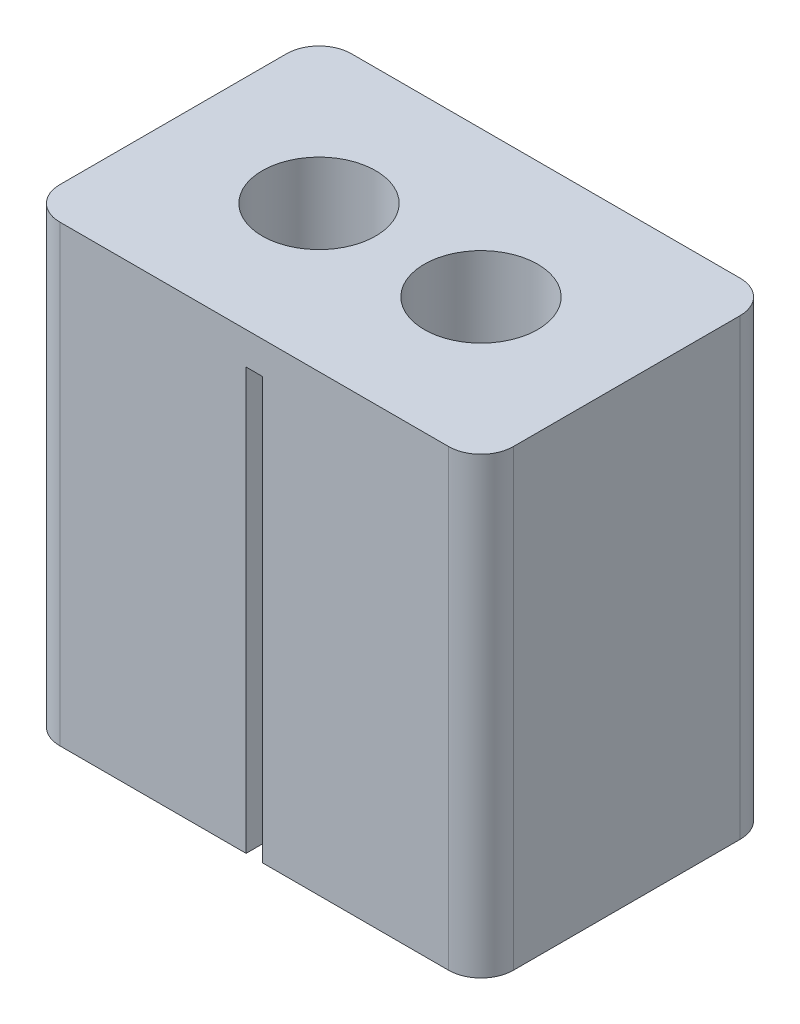
ISO-10303-21;
HEADER;
FILE_DESCRIPTION(('STEP AP214'),'2;1');
FILE_NAME('part.step','',(''),(''),'','','');
FILE_SCHEMA(('AUTOMOTIVE_DESIGN { 1 0 10303 214 1 1 1 1 }'));
ENDSEC;
DATA;
#1=APPLICATION_CONTEXT('core data for automotive mechanical design processes');
#2=APPLICATION_PROTOCOL_DEFINITION('international standard','automotive_design',2000,#1);
#3=PRODUCT_CONTEXT('',#1,'mechanical');
#4=PRODUCT('Part','Part','',(#3));
#5=PRODUCT_RELATED_PRODUCT_CATEGORY('part','',(#4));
#6=PRODUCT_DEFINITION_FORMATION('','',#4);
#7=PRODUCT_DEFINITION_CONTEXT('part definition',#1,'design');
#8=PRODUCT_DEFINITION('design','',#6,#7);
#9=PRODUCT_DEFINITION_SHAPE('','',#8);
#10=(LENGTH_UNIT() NAMED_UNIT(*) SI_UNIT(.MILLI.,.METRE.));
#11=(NAMED_UNIT(*) PLANE_ANGLE_UNIT() SI_UNIT($,.RADIAN.));
#12=(NAMED_UNIT(*) SI_UNIT($,.STERADIAN.) SOLID_ANGLE_UNIT());
#13=UNCERTAINTY_MEASURE_WITH_UNIT(LENGTH_MEASURE(1.E-05),#10,'distance_accuracy_value','');
#14=(GEOMETRIC_REPRESENTATION_CONTEXT(3) GLOBAL_UNCERTAINTY_ASSIGNED_CONTEXT((#13)) GLOBAL_UNIT_ASSIGNED_CONTEXT((#10,
#11,#12)) REPRESENTATION_CONTEXT('',''));
#15=CARTESIAN_POINT('',(0.,0.,0.));
#16=DIRECTION('',(0.,0.,1.));
#17=DIRECTION('',(1.,0.,0.));
#18=AXIS2_PLACEMENT_3D('',#15,#16,#17);
#19=CARTESIAN_POINT('',(0.,0.,0.));
#20=DIRECTION('',(0.,1.,0.));
#21=DIRECTION('',(0.,0.,1.));
#22=AXIS2_PLACEMENT_3D('',#19,#20,#21);
#23=PLANE('',#22);
#24=CARTESIAN_POINT('',(2.5,0.,0.));
#25=DIRECTION('',(0.,1.,0.));
#26=DIRECTION('',(0.,0.,1.));
#27=AXIS2_PLACEMENT_3D('',#24,#25,#26);
#28=CIRCLE('',#27,0.95);
#29=CARTESIAN_POINT('',(2.5,0.,0.950000000000001));
#30=VERTEX_POINT('',#29);
#31=EDGE_CURVE('E219',#30,#30,#28,.F.);
#32=ORIENTED_EDGE('',*,*,#31,.F.);
#33=EDGE_LOOP('',(#32));
#34=FACE_BOUND('',#33,.T.);
#35=DIRECTION('',(1.,0.,0.));
#36=VECTOR('',#35,1.);
#37=CARTESIAN_POINT('',(-7.,0.,4.5));
#38=LINE('',#37,#36);
#39=CARTESIAN_POINT('',(0.25,0.,4.5));
#40=VERTEX_POINT('',#39);
#41=CARTESIAN_POINT('',(6.,0.,4.5));
#42=VERTEX_POINT('',#41);
#43=EDGE_CURVE('E141',#40,#42,#38,.T.);
#44=ORIENTED_EDGE('',*,*,#43,.F.);
#45=DIRECTION('',(0.,0.,1.));
#46=VECTOR('',#45,1.);
#47=CARTESIAN_POINT('',(0.25,0.,4.5));
#48=LINE('',#47,#46);
#49=CARTESIAN_POINT('',(0.25,0.,-4.5));
#50=VERTEX_POINT('',#49);
#51=EDGE_CURVE('E126',#50,#40,#48,.T.);
#52=ORIENTED_EDGE('',*,*,#51,.F.);
#53=DIRECTION('',(-1.,0.,0.));
#54=VECTOR('',#53,1.);
#55=CARTESIAN_POINT('',(-7.,0.,-4.5));
#56=LINE('',#55,#54);
#57=CARTESIAN_POINT('',(6.,0.,-4.5));
#58=VERTEX_POINT('',#57);
#59=EDGE_CURVE('E139',#58,#50,#56,.T.);
#60=ORIENTED_EDGE('',*,*,#59,.F.);
#61=CARTESIAN_POINT('',(6.,0.,-3.5));
#62=DIRECTION('',(0.,1.,0.));
#63=DIRECTION('',(0.,0.,1.));
#64=AXIS2_PLACEMENT_3D('',#61,#62,#63);
#65=CIRCLE('',#64,1.);
#66=CARTESIAN_POINT('',(7.,0.,-3.5));
#67=VERTEX_POINT('',#66);
#68=EDGE_CURVE('E172',#58,#67,#65,.F.);
#69=ORIENTED_EDGE('',*,*,#68,.T.);
#70=DIRECTION('',(0.,0.,-1.));
#71=VECTOR('',#70,1.);
#72=CARTESIAN_POINT('',(7.,0.,-4.5));
#73=LINE('',#72,#71);
#74=CARTESIAN_POINT('',(7.,0.,3.5));
#75=VERTEX_POINT('',#74);
#76=EDGE_CURVE('E154',#75,#67,#73,.T.);
#77=ORIENTED_EDGE('',*,*,#76,.F.);
#78=CARTESIAN_POINT('',(6.,0.,3.5));
#79=DIRECTION('',(0.,1.,0.));
#80=DIRECTION('',(0.,0.,1.));
#81=AXIS2_PLACEMENT_3D('',#78,#79,#80);
#82=CIRCLE('',#81,1.);
#83=EDGE_CURVE('E170',#75,#42,#82,.F.);
#84=ORIENTED_EDGE('',*,*,#83,.T.);
#85=EDGE_LOOP('',(#44,#52,#60,#69,#77,#84));
#86=FACE_BOUND('',#85,.T.);
#87=ADVANCED_FACE('F35',(#34,#86),#23,.F.);
#88=CARTESIAN_POINT('',(7.,14.,-4.5));
#89=DIRECTION('',(-1.,0.,0.));
#90=DIRECTION('',(0.,0.,1.));
#91=AXIS2_PLACEMENT_3D('',#88,#89,#90);
#92=PLANE('',#91);
#93=ORIENTED_EDGE('',*,*,#76,.T.);
#94=DIRECTION('',(0.,-1.,0.));
#95=VECTOR('',#94,1.);
#96=CARTESIAN_POINT('',(7.,14.,-3.5));
#97=LINE('',#96,#95);
#98=CARTESIAN_POINT('',(7.,14.,-3.5));
#99=VERTEX_POINT('',#98);
#100=EDGE_CURVE('E191',#67,#99,#97,.F.);
#101=ORIENTED_EDGE('',*,*,#100,.T.);
#102=DIRECTION('',(0.,0.,-1.));
#103=VECTOR('',#102,1.);
#104=CARTESIAN_POINT('',(7.,14.,-4.5));
#105=LINE('',#104,#103);
#106=CARTESIAN_POINT('',(7.,14.,3.5));
#107=VERTEX_POINT('',#106);
#108=EDGE_CURVE('E161',#107,#99,#105,.T.);
#109=ORIENTED_EDGE('',*,*,#108,.F.);
#110=DIRECTION('',(0.,-1.,0.));
#111=VECTOR('',#110,1.);
#112=CARTESIAN_POINT('',(7.,14.,3.5));
#113=LINE('',#112,#111);
#114=EDGE_CURVE('E188',#107,#75,#113,.T.);
#115=ORIENTED_EDGE('',*,*,#114,.T.);
#116=EDGE_LOOP('',(#93,#101,#109,#115));
#117=FACE_BOUND('',#116,.T.);
#118=ADVANCED_FACE('F257',(#117),#92,.F.);
#119=CARTESIAN_POINT('',(-7.,14.,-4.5));
#120=DIRECTION('',(0.,0.,1.));
#121=DIRECTION('',(1.,0.,0.));
#122=AXIS2_PLACEMENT_3D('',#119,#120,#121);
#123=PLANE('',#122);
#124=ORIENTED_EDGE('',*,*,#59,.T.);
#125=DIRECTION('',(0.,1.,0.));
#126=VECTOR('',#125,1.);
#127=CARTESIAN_POINT('',(0.25,-0.000999999999999265,-4.5));
#128=LINE('',#127,#126);
#129=CARTESIAN_POINT('',(0.25,13.,-4.5));
#130=VERTEX_POINT('',#129);
#131=EDGE_CURVE('E123',#50,#130,#128,.T.);
#132=ORIENTED_EDGE('',*,*,#131,.T.);
#133=DIRECTION('',(-1.,0.,0.));
#134=VECTOR('',#133,1.);
#135=CARTESIAN_POINT('',(-0.25,13.,-4.5));
#136=LINE('',#135,#134);
#137=CARTESIAN_POINT('',(-0.25,13.,-4.5));
#138=VERTEX_POINT('',#137);
#139=EDGE_CURVE('E207',#130,#138,#136,.T.);
#140=ORIENTED_EDGE('',*,*,#139,.T.);
#141=DIRECTION('',(0.,1.,0.));
#142=VECTOR('',#141,1.);
#143=CARTESIAN_POINT('',(-0.25,-0.000999999999999265,-4.5));
#144=LINE('',#143,#142);
#145=CARTESIAN_POINT('',(-0.25,0.,-4.5));
#146=VERTEX_POINT('',#145);
#147=EDGE_CURVE('E133',#146,#138,#144,.T.);
#148=ORIENTED_EDGE('',*,*,#147,.F.);
#149=CARTESIAN_POINT('',(-6.,0.,-4.5));
#150=VERTEX_POINT('',#149);
#151=EDGE_CURVE('E150',#146,#150,#56,.T.);
#152=ORIENTED_EDGE('',*,*,#151,.T.);
#153=DIRECTION('',(0.,-1.,0.));
#154=VECTOR('',#153,1.);
#155=CARTESIAN_POINT('',(-6.,14.,-4.5));
#156=LINE('',#155,#154);
#157=CARTESIAN_POINT('',(-6.,14.,-4.5));
#158=VERTEX_POINT('',#157);
#159=EDGE_CURVE('E178',#150,#158,#156,.F.);
#160=ORIENTED_EDGE('',*,*,#159,.T.);
#161=DIRECTION('',(-1.,0.,0.));
#162=VECTOR('',#161,1.);
#163=CARTESIAN_POINT('',(-7.,14.,-4.5));
#164=LINE('',#163,#162);
#165=CARTESIAN_POINT('',(6.,14.,-4.5));
#166=VERTEX_POINT('',#165);
#167=EDGE_CURVE('E242',#166,#158,#164,.T.);
#168=ORIENTED_EDGE('',*,*,#167,.F.);
#169=DIRECTION('',(0.,-1.,0.));
#170=VECTOR('',#169,1.);
#171=CARTESIAN_POINT('',(6.,14.,-4.5));
#172=LINE('',#171,#170);
#173=EDGE_CURVE('E148',#166,#58,#172,.T.);
#174=ORIENTED_EDGE('',*,*,#173,.T.);
#175=EDGE_LOOP('',(#124,#132,#140,#148,#152,#160,#168,#174));
#176=FACE_BOUND('',#175,.T.);
#177=ADVANCED_FACE('F145',(#176),#123,.F.);
#178=CARTESIAN_POINT('',(-7.,14.,-4.5));
#179=DIRECTION('',(1.,0.,0.));
#180=DIRECTION('',(0.,0.,-1.));
#181=AXIS2_PLACEMENT_3D('',#178,#179,#180);
#182=PLANE('',#181);
#183=DIRECTION('',(0.,0.,1.));
#184=VECTOR('',#183,1.);
#185=CARTESIAN_POINT('',(-7.,14.,-4.5));
#186=LINE('',#185,#184);
#187=CARTESIAN_POINT('',(-7.,14.,-3.5));
#188=VERTEX_POINT('',#187);
#189=CARTESIAN_POINT('',(-7.,14.,3.5));
#190=VERTEX_POINT('',#189);
#191=EDGE_CURVE('E245',#188,#190,#186,.T.);
#192=ORIENTED_EDGE('',*,*,#191,.F.);
#193=DIRECTION('',(0.,-1.,0.));
#194=VECTOR('',#193,1.);
#195=CARTESIAN_POINT('',(-7.,14.,-3.5));
#196=LINE('',#195,#194);
#197=CARTESIAN_POINT('',(-7.,0.,-3.5));
#198=VERTEX_POINT('',#197);
#199=EDGE_CURVE('E164',#188,#198,#196,.T.);
#200=ORIENTED_EDGE('',*,*,#199,.T.);
#201=DIRECTION('',(0.,0.,1.));
#202=VECTOR('',#201,1.);
#203=CARTESIAN_POINT('',(-7.,0.,-4.5));
#204=LINE('',#203,#202);
#205=CARTESIAN_POINT('',(-7.,0.,3.5));
#206=VERTEX_POINT('',#205);
#207=EDGE_CURVE('E149',#198,#206,#204,.T.);
#208=ORIENTED_EDGE('',*,*,#207,.T.);
#209=DIRECTION('',(0.,-1.,0.));
#210=VECTOR('',#209,1.);
#211=CARTESIAN_POINT('',(-7.,14.,3.5));
#212=LINE('',#211,#210);
#213=EDGE_CURVE('E162',#206,#190,#212,.F.);
#214=ORIENTED_EDGE('',*,*,#213,.T.);
#215=EDGE_LOOP('',(#192,#200,#208,#214));
#216=FACE_BOUND('',#215,.T.);
#217=ADVANCED_FACE('F269',(#216),#182,.F.);
#218=CARTESIAN_POINT('',(-7.,14.,4.5));
#219=DIRECTION('',(0.,0.,-1.));
#220=DIRECTION('',(-1.,0.,0.));
#221=AXIS2_PLACEMENT_3D('',#218,#219,#220);
#222=PLANE('',#221);
#223=DIRECTION('',(1.,0.,0.));
#224=VECTOR('',#223,1.);
#225=CARTESIAN_POINT('',(-0.25,13.,4.5));
#226=LINE('',#225,#224);
#227=CARTESIAN_POINT('',(-0.25,13.,4.5));
#228=VERTEX_POINT('',#227);
#229=CARTESIAN_POINT('',(0.25,13.,4.5));
#230=VERTEX_POINT('',#229);
#231=EDGE_CURVE('E134',#228,#230,#226,.T.);
#232=ORIENTED_EDGE('',*,*,#231,.T.);
#233=DIRECTION('',(0.,1.,0.));
#234=VECTOR('',#233,1.);
#235=CARTESIAN_POINT('',(0.25,-0.000999999999999265,4.5));
#236=LINE('',#235,#234);
#237=EDGE_CURVE('E212',#40,#230,#236,.T.);
#238=ORIENTED_EDGE('',*,*,#237,.F.);
#239=ORIENTED_EDGE('',*,*,#43,.T.);
#240=DIRECTION('',(0.,-1.,0.));
#241=VECTOR('',#240,1.);
#242=CARTESIAN_POINT('',(6.,14.,4.5));
#243=LINE('',#242,#241);
#244=CARTESIAN_POINT('',(6.,14.,4.5));
#245=VERTEX_POINT('',#244);
#246=EDGE_CURVE('E11',#42,#245,#243,.F.);
#247=ORIENTED_EDGE('',*,*,#246,.T.);
#248=DIRECTION('',(1.,0.,0.));
#249=VECTOR('',#248,1.);
#250=CARTESIAN_POINT('',(-7.,14.,4.5));
#251=LINE('',#250,#249);
#252=CARTESIAN_POINT('',(-6.,14.,4.5));
#253=VERTEX_POINT('',#252);
#254=EDGE_CURVE('E165',#253,#245,#251,.T.);
#255=ORIENTED_EDGE('',*,*,#254,.F.);
#256=DIRECTION('',(0.,-1.,0.));
#257=VECTOR('',#256,1.);
#258=CARTESIAN_POINT('',(-6.,14.,4.5));
#259=LINE('',#258,#257);
#260=CARTESIAN_POINT('',(-6.,0.,4.5));
#261=VERTEX_POINT('',#260);
#262=EDGE_CURVE('E43',#253,#261,#259,.T.);
#263=ORIENTED_EDGE('',*,*,#262,.T.);
#264=CARTESIAN_POINT('',(-0.25,0.,4.5));
#265=VERTEX_POINT('',#264);
#266=EDGE_CURVE('E158',#261,#265,#38,.T.);
#267=ORIENTED_EDGE('',*,*,#266,.T.);
#268=DIRECTION('',(0.,1.,0.));
#269=VECTOR('',#268,1.);
#270=CARTESIAN_POINT('',(-0.25,-0.000999999999999265,4.5));
#271=LINE('',#270,#269);
#272=EDGE_CURVE('E50',#265,#228,#271,.T.);
#273=ORIENTED_EDGE('',*,*,#272,.T.);
#274=EDGE_LOOP('',(#232,#238,#239,#247,#255,#263,#267,#273));
#275=FACE_BOUND('',#274,.T.);
#276=ADVANCED_FACE('F196',(#275),#222,.F.);
#277=CARTESIAN_POINT('',(0.,14.,0.));
#278=DIRECTION('',(0.,1.,0.));
#279=DIRECTION('',(0.,0.,1.));
#280=AXIS2_PLACEMENT_3D('',#277,#278,#279);
#281=PLANE('',#280);
#282=CARTESIAN_POINT('',(2.5,14.,0.));
#283=DIRECTION('',(0.,1.,0.));
#284=DIRECTION('',(0.,0.,-1.));
#285=AXIS2_PLACEMENT_3D('',#282,#283,#284);
#286=CIRCLE('',#285,1.75);
#287=CARTESIAN_POINT('',(2.5,14.,-1.75));
#288=VERTEX_POINT('',#287);
#289=EDGE_CURVE('E228',#288,#288,#286,.T.);
#290=ORIENTED_EDGE('',*,*,#289,.F.);
#291=EDGE_LOOP('',(#290));
#292=FACE_BOUND('',#291,.T.);
#293=CARTESIAN_POINT('',(-2.5,14.,0.));
#294=DIRECTION('',(0.,1.,0.));
#295=DIRECTION('',(0.,0.,1.));
#296=AXIS2_PLACEMENT_3D('',#293,#294,#295);
#297=CIRCLE('',#296,1.75);
#298=CARTESIAN_POINT('',(-2.5,14.,1.75));
#299=VERTEX_POINT('',#298);
#300=EDGE_CURVE('E232',#299,#299,#297,.T.);
#301=ORIENTED_EDGE('',*,*,#300,.F.);
#302=EDGE_LOOP('',(#301));
#303=FACE_BOUND('',#302,.T.);
#304=ORIENTED_EDGE('',*,*,#167,.T.);
#305=CARTESIAN_POINT('',(-6.,14.,-3.5));
#306=DIRECTION('',(0.,1.,0.));
#307=DIRECTION('',(0.,0.,1.));
#308=AXIS2_PLACEMENT_3D('',#305,#306,#307);
#309=CIRCLE('',#308,1.);
#310=EDGE_CURVE('E186',#158,#188,#309,.T.);
#311=ORIENTED_EDGE('',*,*,#310,.T.);
#312=ORIENTED_EDGE('',*,*,#191,.T.);
#313=CARTESIAN_POINT('',(-6.,14.,3.5));
#314=DIRECTION('',(0.,1.,0.));
#315=DIRECTION('',(0.,0.,1.));
#316=AXIS2_PLACEMENT_3D('',#313,#314,#315);
#317=CIRCLE('',#316,1.);
#318=EDGE_CURVE('E180',#190,#253,#317,.T.);
#319=ORIENTED_EDGE('',*,*,#318,.T.);
#320=ORIENTED_EDGE('',*,*,#254,.T.);
#321=CARTESIAN_POINT('',(6.,14.,3.5));
#322=DIRECTION('',(0.,1.,0.));
#323=DIRECTION('',(0.,0.,1.));
#324=AXIS2_PLACEMENT_3D('',#321,#322,#323);
#325=CIRCLE('',#324,1.);
#326=EDGE_CURVE('E182',#245,#107,#325,.T.);
#327=ORIENTED_EDGE('',*,*,#326,.T.);
#328=ORIENTED_EDGE('',*,*,#108,.T.);
#329=CARTESIAN_POINT('',(6.,14.,-3.5));
#330=DIRECTION('',(0.,1.,0.));
#331=DIRECTION('',(0.,0.,1.));
#332=AXIS2_PLACEMENT_3D('',#329,#330,#331);
#333=CIRCLE('',#332,1.);
#334=EDGE_CURVE('E184',#99,#166,#333,.T.);
#335=ORIENTED_EDGE('',*,*,#334,.T.);
#336=EDGE_LOOP('',(#304,#311,#312,#319,#320,#327,#328,#335));
#337=FACE_BOUND('',#336,.T.);
#338=ADVANCED_FACE('F249',(#292,#303,#337),#281,.T.);
#339=CARTESIAN_POINT('',(-2.5,0.,0.));
#340=DIRECTION('',(0.,1.,0.));
#341=DIRECTION('',(0.,0.,1.));
#342=AXIS2_PLACEMENT_3D('',#339,#340,#341);
#343=CIRCLE('',#342,0.95);
#344=CARTESIAN_POINT('',(-2.5,0.,0.95));
#345=VERTEX_POINT('',#344);
#346=EDGE_CURVE('E225',#345,#345,#343,.F.);
#347=ORIENTED_EDGE('',*,*,#346,.F.);
#348=EDGE_LOOP('',(#347));
#349=FACE_BOUND('',#348,.T.);
#350=ORIENTED_EDGE('',*,*,#151,.F.);
#351=DIRECTION('',(0.,0.,-1.));
#352=VECTOR('',#351,1.);
#353=CARTESIAN_POINT('',(-0.25,0.,4.5));
#354=LINE('',#353,#352);
#355=EDGE_CURVE('E142',#265,#146,#354,.T.);
#356=ORIENTED_EDGE('',*,*,#355,.F.);
#357=ORIENTED_EDGE('',*,*,#266,.F.);
#358=CARTESIAN_POINT('',(-6.,0.,3.5));
#359=DIRECTION('',(0.,1.,0.));
#360=DIRECTION('',(0.,0.,1.));
#361=AXIS2_PLACEMENT_3D('',#358,#359,#360);
#362=CIRCLE('',#361,1.);
#363=EDGE_CURVE('E168',#261,#206,#362,.F.);
#364=ORIENTED_EDGE('',*,*,#363,.T.);
#365=ORIENTED_EDGE('',*,*,#207,.F.);
#366=CARTESIAN_POINT('',(-6.,0.,-3.5));
#367=DIRECTION('',(0.,1.,0.));
#368=DIRECTION('',(0.,0.,1.));
#369=AXIS2_PLACEMENT_3D('',#366,#367,#368);
#370=CIRCLE('',#369,1.);
#371=EDGE_CURVE('E174',#198,#150,#370,.F.);
#372=ORIENTED_EDGE('',*,*,#371,.T.);
#373=EDGE_LOOP('',(#350,#356,#357,#364,#365,#372));
#374=FACE_BOUND('',#373,.T.);
#375=ADVANCED_FACE('F201',(#349,#374),#23,.F.);
#376=CARTESIAN_POINT('',(-6.,14.,-3.5));
#377=DIRECTION('',(0.,-1.,0.));
#378=DIRECTION('',(0.,0.,-1.));
#379=AXIS2_PLACEMENT_3D('',#376,#377,#378);
#380=CYLINDRICAL_SURFACE('',#379,1.);
#381=ORIENTED_EDGE('',*,*,#310,.F.);
#382=ORIENTED_EDGE('',*,*,#159,.F.);
#383=ORIENTED_EDGE('',*,*,#371,.F.);
#384=ORIENTED_EDGE('',*,*,#199,.F.);
#385=EDGE_LOOP('',(#381,#382,#383,#384));
#386=FACE_BOUND('',#385,.T.);
#387=ADVANCED_FACE('F265',(#386),#380,.T.);
#388=CARTESIAN_POINT('',(6.,14.,-3.5));
#389=DIRECTION('',(0.,-1.,0.));
#390=DIRECTION('',(0.,0.,-1.));
#391=AXIS2_PLACEMENT_3D('',#388,#389,#390);
#392=CYLINDRICAL_SURFACE('',#391,1.);
#393=ORIENTED_EDGE('',*,*,#334,.F.);
#394=ORIENTED_EDGE('',*,*,#100,.F.);
#395=ORIENTED_EDGE('',*,*,#68,.F.);
#396=ORIENTED_EDGE('',*,*,#173,.F.);
#397=EDGE_LOOP('',(#393,#394,#395,#396));
#398=FACE_BOUND('',#397,.T.);
#399=ADVANCED_FACE('F261',(#398),#392,.T.);
#400=CARTESIAN_POINT('',(6.,14.,3.5));
#401=DIRECTION('',(0.,-1.,0.));
#402=DIRECTION('',(0.,0.,-1.));
#403=AXIS2_PLACEMENT_3D('',#400,#401,#402);
#404=CYLINDRICAL_SURFACE('',#403,1.);
#405=ORIENTED_EDGE('',*,*,#326,.F.);
#406=ORIENTED_EDGE('',*,*,#246,.F.);
#407=ORIENTED_EDGE('',*,*,#83,.F.);
#408=ORIENTED_EDGE('',*,*,#114,.F.);
#409=EDGE_LOOP('',(#405,#406,#407,#408));
#410=FACE_BOUND('',#409,.T.);
#411=ADVANCED_FACE('F253',(#410),#404,.T.);
#412=CARTESIAN_POINT('',(-6.,14.,3.5));
#413=DIRECTION('',(0.,-1.,0.));
#414=DIRECTION('',(0.,0.,-1.));
#415=AXIS2_PLACEMENT_3D('',#412,#413,#414);
#416=CYLINDRICAL_SURFACE('',#415,1.);
#417=ORIENTED_EDGE('',*,*,#318,.F.);
#418=ORIENTED_EDGE('',*,*,#213,.F.);
#419=ORIENTED_EDGE('',*,*,#363,.F.);
#420=ORIENTED_EDGE('',*,*,#262,.F.);
#421=EDGE_LOOP('',(#417,#418,#419,#420));
#422=FACE_BOUND('',#421,.T.);
#423=ADVANCED_FACE('F37',(#422),#416,.T.);
#424=CARTESIAN_POINT('',(-2.5,7.,0.));
#425=DIRECTION('',(0.,1.,0.));
#426=DIRECTION('',(0.,0.,1.));
#427=AXIS2_PLACEMENT_3D('',#424,#425,#426);
#428=CYLINDRICAL_SURFACE('',#427,1.75);
#429=CARTESIAN_POINT('',(-2.5,7.,0.));
#430=DIRECTION('',(0.,1.,0.));
#431=DIRECTION('',(0.,0.,1.));
#432=AXIS2_PLACEMENT_3D('',#429,#430,#431);
#433=CIRCLE('',#432,1.75);
#434=CARTESIAN_POINT('',(-2.5,7.,1.75));
#435=VERTEX_POINT('',#434);
#436=EDGE_CURVE('E235',#435,#435,#433,.T.);
#437=ORIENTED_EDGE('',*,*,#436,.F.);
#438=EDGE_LOOP('',(#437));
#439=FACE_BOUND('',#438,.T.);
#440=ORIENTED_EDGE('',*,*,#300,.T.);
#441=EDGE_LOOP('',(#440));
#442=FACE_BOUND('',#441,.T.);
#443=ADVANCED_FACE('F272',(#439,#442),#428,.F.);
#444=CARTESIAN_POINT('',(-2.5,7.,0.));
#445=DIRECTION('',(0.,1.,0.));
#446=DIRECTION('',(0.,0.,1.));
#447=AXIS2_PLACEMENT_3D('',#444,#445,#446);
#448=PLANE('',#447);
#449=CARTESIAN_POINT('',(-2.5,7.,0.));
#450=DIRECTION('',(0.,1.,0.));
#451=DIRECTION('',(0.,0.,1.));
#452=AXIS2_PLACEMENT_3D('',#449,#450,#451);
#453=CIRCLE('',#452,0.95);
#454=CARTESIAN_POINT('',(-2.5,7.,0.95));
#455=VERTEX_POINT('',#454);
#456=EDGE_CURVE('E222',#455,#455,#453,.T.);
#457=ORIENTED_EDGE('',*,*,#456,.F.);
#458=EDGE_LOOP('',(#457));
#459=FACE_BOUND('',#458,.T.);
#460=ORIENTED_EDGE('',*,*,#436,.T.);
#461=EDGE_LOOP('',(#460));
#462=FACE_BOUND('',#461,.T.);
#463=ADVANCED_FACE('F277',(#459,#462),#448,.T.);
#464=CARTESIAN_POINT('',(2.5,7.,0.));
#465=DIRECTION('',(0.,1.,0.));
#466=DIRECTION('',(0.,0.,1.));
#467=AXIS2_PLACEMENT_3D('',#464,#465,#466);
#468=CYLINDRICAL_SURFACE('',#467,1.75);
#469=CARTESIAN_POINT('',(2.5,7.,0.));
#470=DIRECTION('',(0.,1.,0.));
#471=DIRECTION('',(0.,0.,-1.));
#472=AXIS2_PLACEMENT_3D('',#469,#470,#471);
#473=CIRCLE('',#472,1.75);
#474=CARTESIAN_POINT('',(2.5,7.,-1.75));
#475=VERTEX_POINT('',#474);
#476=EDGE_CURVE('E229',#475,#475,#473,.T.);
#477=ORIENTED_EDGE('',*,*,#476,.F.);
#478=EDGE_LOOP('',(#477));
#479=FACE_BOUND('',#478,.T.);
#480=ORIENTED_EDGE('',*,*,#289,.T.);
#481=EDGE_LOOP('',(#480));
#482=FACE_BOUND('',#481,.T.);
#483=ADVANCED_FACE('F312',(#479,#482),#468,.F.);
#484=CARTESIAN_POINT('',(2.5,7.,0.));
#485=DIRECTION('',(0.,-1.,0.));
#486=DIRECTION('',(0.,0.,-1.));
#487=AXIS2_PLACEMENT_3D('',#484,#485,#486);
#488=PLANE('',#487);
#489=CARTESIAN_POINT('',(2.5,7.,0.));
#490=DIRECTION('',(0.,1.,0.));
#491=DIRECTION('',(0.,0.,1.));
#492=AXIS2_PLACEMENT_3D('',#489,#490,#491);
#493=CIRCLE('',#492,0.95);
#494=CARTESIAN_POINT('',(2.5,7.,0.950000000000001));
#495=VERTEX_POINT('',#494);
#496=EDGE_CURVE('E214',#495,#495,#493,.T.);
#497=ORIENTED_EDGE('',*,*,#496,.F.);
#498=EDGE_LOOP('',(#497));
#499=FACE_BOUND('',#498,.T.);
#500=ORIENTED_EDGE('',*,*,#476,.T.);
#501=EDGE_LOOP('',(#500));
#502=FACE_BOUND('',#501,.T.);
#503=ADVANCED_FACE('F303',(#499,#502),#488,.F.);
#504=CARTESIAN_POINT('',(-2.5,-0.00100000000000013,0.));
#505=DIRECTION('',(0.,1.,0.));
#506=DIRECTION('',(0.,0.,1.));
#507=AXIS2_PLACEMENT_3D('',#504,#505,#506);
#508=CYLINDRICAL_SURFACE('',#507,0.95);
#509=ORIENTED_EDGE('',*,*,#456,.T.);
#510=EDGE_LOOP('',(#509));
#511=FACE_BOUND('',#510,.T.);
#512=ORIENTED_EDGE('',*,*,#346,.T.);
#513=EDGE_LOOP('',(#512));
#514=FACE_BOUND('',#513,.T.);
#515=ADVANCED_FACE('F300',(#511,#514),#508,.F.);
#516=CARTESIAN_POINT('',(2.5,-0.00100000000000013,0.));
#517=DIRECTION('',(0.,1.,0.));
#518=DIRECTION('',(0.,0.,1.));
#519=AXIS2_PLACEMENT_3D('',#516,#517,#518);
#520=CYLINDRICAL_SURFACE('',#519,0.95);
#521=ORIENTED_EDGE('',*,*,#496,.T.);
#522=EDGE_LOOP('',(#521));
#523=FACE_BOUND('',#522,.T.);
#524=ORIENTED_EDGE('',*,*,#31,.T.);
#525=EDGE_LOOP('',(#524));
#526=FACE_BOUND('',#525,.T.);
#527=ADVANCED_FACE('F302',(#523,#526),#520,.F.);
#528=CARTESIAN_POINT('',(0.25,-0.000999999999999265,4.5));
#529=DIRECTION('',(1.,0.,0.));
#530=DIRECTION('',(0.,0.,-1.));
#531=AXIS2_PLACEMENT_3D('',#528,#529,#530);
#532=PLANE('',#531);
#533=ORIENTED_EDGE('',*,*,#51,.T.);
#534=ORIENTED_EDGE('',*,*,#237,.T.);
#535=DIRECTION('',(0.,0.,-1.));
#536=VECTOR('',#535,1.);
#537=CARTESIAN_POINT('',(0.25,13.,4.5));
#538=LINE('',#537,#536);
#539=EDGE_CURVE('E129',#230,#130,#538,.T.);
#540=ORIENTED_EDGE('',*,*,#539,.T.);
#541=ORIENTED_EDGE('',*,*,#131,.F.);
#542=EDGE_LOOP('',(#533,#534,#540,#541));
#543=FACE_BOUND('',#542,.T.);
#544=ADVANCED_FACE('F125',(#543),#532,.F.);
#545=CARTESIAN_POINT('',(-0.25,-0.000999999999999265,4.5));
#546=DIRECTION('',(-1.,0.,0.));
#547=DIRECTION('',(0.,0.,1.));
#548=AXIS2_PLACEMENT_3D('',#545,#546,#547);
#549=PLANE('',#548);
#550=ORIENTED_EDGE('',*,*,#355,.T.);
#551=ORIENTED_EDGE('',*,*,#147,.T.);
#552=DIRECTION('',(0.,0.,1.));
#553=VECTOR('',#552,1.);
#554=CARTESIAN_POINT('',(-0.25,13.,4.5));
#555=LINE('',#554,#553);
#556=EDGE_CURVE('E209',#138,#228,#555,.T.);
#557=ORIENTED_EDGE('',*,*,#556,.T.);
#558=ORIENTED_EDGE('',*,*,#272,.F.);
#559=EDGE_LOOP('',(#550,#551,#557,#558));
#560=FACE_BOUND('',#559,.T.);
#561=ADVANCED_FACE('F387',(#560),#549,.F.);
#562=CARTESIAN_POINT('',(0.,13.,0.));
#563=DIRECTION('',(0.,-1.,0.));
#564=DIRECTION('',(0.,0.,-1.));
#565=AXIS2_PLACEMENT_3D('',#562,#563,#564);
#566=PLANE('',#565);
#567=ORIENTED_EDGE('',*,*,#539,.F.);
#568=ORIENTED_EDGE('',*,*,#231,.F.);
#569=ORIENTED_EDGE('',*,*,#556,.F.);
#570=ORIENTED_EDGE('',*,*,#139,.F.);
#571=EDGE_LOOP('',(#567,#568,#569,#570));
#572=FACE_BOUND('',#571,.T.);
#573=ADVANCED_FACE('F395',(#572),#566,.T.);
#574=CLOSED_SHELL('',(#87,#118,#177,#217,#276,#338,#375,#387,#399,#411,#423,#443,#463,#483,#503,
#515,#527,#544,#561,#573));
#575=MANIFOLD_SOLID_BREP('B2',#574);
#576=ADVANCED_BREP_SHAPE_REPRESENTATION('',(#18,#575),#14);
#577=SHAPE_DEFINITION_REPRESENTATION(#9,#576);
ENDSEC;
END-ISO-10303-21;
